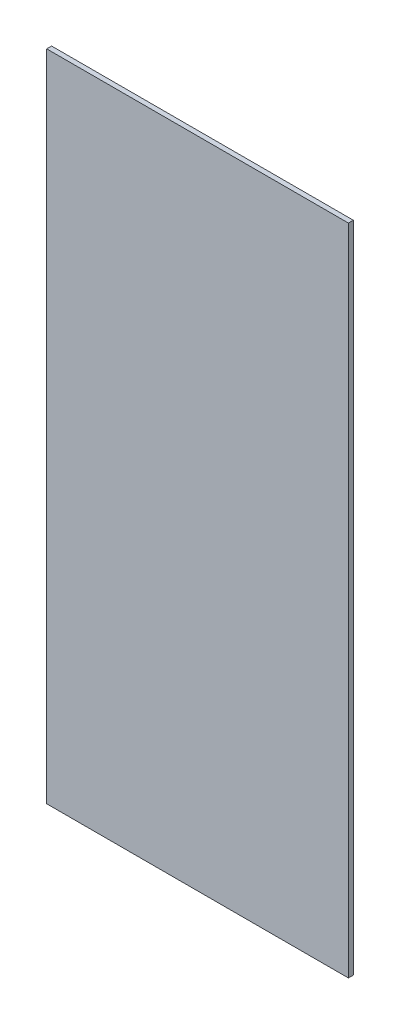
ISO-10303-21;
HEADER;
FILE_DESCRIPTION(('STEP AP214'),'2;1');
FILE_NAME('part.step','',(''),(''),'','','');
FILE_SCHEMA(('AUTOMOTIVE_DESIGN { 1 0 10303 214 1 1 1 1 }'));
ENDSEC;
DATA;
#1=APPLICATION_CONTEXT('core data for automotive mechanical design processes');
#2=APPLICATION_PROTOCOL_DEFINITION('international standard','automotive_design',2000,#1);
#3=PRODUCT_CONTEXT('',#1,'mechanical');
#4=PRODUCT('Part','Part','',(#3));
#5=PRODUCT_RELATED_PRODUCT_CATEGORY('part','',(#4));
#6=PRODUCT_DEFINITION_FORMATION('','',#4);
#7=PRODUCT_DEFINITION_CONTEXT('part definition',#1,'design');
#8=PRODUCT_DEFINITION('design','',#6,#7);
#9=PRODUCT_DEFINITION_SHAPE('','',#8);
#10=(LENGTH_UNIT() NAMED_UNIT(*) SI_UNIT(.MILLI.,.METRE.));
#11=(NAMED_UNIT(*) PLANE_ANGLE_UNIT() SI_UNIT($,.RADIAN.));
#12=(NAMED_UNIT(*) SI_UNIT($,.STERADIAN.) SOLID_ANGLE_UNIT());
#13=UNCERTAINTY_MEASURE_WITH_UNIT(LENGTH_MEASURE(1.E-05),#10,'distance_accuracy_value','');
#14=(GEOMETRIC_REPRESENTATION_CONTEXT(3) GLOBAL_UNCERTAINTY_ASSIGNED_CONTEXT((#13)) GLOBAL_UNIT_ASSIGNED_CONTEXT((#10,
#11,#12)) REPRESENTATION_CONTEXT('',''));
#15=CARTESIAN_POINT('',(0.,0.,0.));
#16=DIRECTION('',(0.,0.,1.));
#17=DIRECTION('',(1.,0.,0.));
#18=AXIS2_PLACEMENT_3D('',#15,#16,#17);
#19=CARTESIAN_POINT('',(0.,533.,0.));
#20=DIRECTION('',(1.,0.,0.));
#21=DIRECTION('',(0.,0.,-1.));
#22=AXIS2_PLACEMENT_3D('',#19,#20,#21);
#23=PLANE('',#22);
#24=DIRECTION('',(0.,0.,1.));
#25=VECTOR('',#24,1.);
#26=CARTESIAN_POINT('',(0.,0.,0.));
#27=LINE('',#26,#25);
#28=CARTESIAN_POINT('',(0.,0.,0.));
#29=VERTEX_POINT('',#28);
#30=CARTESIAN_POINT('',(0.,0.,4.));
#31=VERTEX_POINT('',#30);
#32=EDGE_CURVE('E96',#29,#31,#27,.T.);
#33=ORIENTED_EDGE('',*,*,#32,.T.);
#34=DIRECTION('',(0.,-1.,0.));
#35=VECTOR('',#34,1.);
#36=CARTESIAN_POINT('',(0.,533.,4.));
#37=LINE('',#36,#35);
#38=CARTESIAN_POINT('',(0.,533.,4.));
#39=VERTEX_POINT('',#38);
#40=EDGE_CURVE('E11',#39,#31,#37,.T.);
#41=ORIENTED_EDGE('',*,*,#40,.F.);
#42=DIRECTION('',(0.,0.,1.));
#43=VECTOR('',#42,1.);
#44=CARTESIAN_POINT('',(0.,533.,0.));
#45=LINE('',#44,#43);
#46=CARTESIAN_POINT('',(0.,533.,0.));
#47=VERTEX_POINT('',#46);
#48=EDGE_CURVE('E84',#47,#39,#45,.T.);
#49=ORIENTED_EDGE('',*,*,#48,.F.);
#50=DIRECTION('',(0.,-1.,0.));
#51=VECTOR('',#50,1.);
#52=CARTESIAN_POINT('',(0.,533.,0.));
#53=LINE('',#52,#51);
#54=EDGE_CURVE('E92',#47,#29,#53,.T.);
#55=ORIENTED_EDGE('',*,*,#54,.T.);
#56=EDGE_LOOP('',(#33,#41,#49,#55));
#57=FACE_BOUND('',#56,.T.);
#58=ADVANCED_FACE('F33',(#57),#23,.F.);
#59=CARTESIAN_POINT('',(0.,533.,4.));
#60=DIRECTION('',(0.,0.,-1.));
#61=DIRECTION('',(-1.,0.,0.));
#62=AXIS2_PLACEMENT_3D('',#59,#60,#61);
#63=PLANE('',#62);
#64=DIRECTION('',(1.,0.,0.));
#65=VECTOR('',#64,1.);
#66=CARTESIAN_POINT('',(0.,0.,4.));
#67=LINE('',#66,#65);
#68=CARTESIAN_POINT('',(245.985170549936,0.,4.));
#69=VERTEX_POINT('',#68);
#70=EDGE_CURVE('E88',#31,#69,#67,.T.);
#71=ORIENTED_EDGE('',*,*,#70,.T.);
#72=DIRECTION('',(0.,-1.,0.));
#73=VECTOR('',#72,1.);
#74=CARTESIAN_POINT('',(245.985170549936,533.,4.));
#75=LINE('',#74,#73);
#76=CARTESIAN_POINT('',(245.985170549936,533.,4.));
#77=VERTEX_POINT('',#76);
#78=EDGE_CURVE('E41',#77,#69,#75,.T.);
#79=ORIENTED_EDGE('',*,*,#78,.F.);
#80=DIRECTION('',(1.,0.,0.));
#81=VECTOR('',#80,1.);
#82=CARTESIAN_POINT('',(0.,533.,4.));
#83=LINE('',#82,#81);
#84=EDGE_CURVE('E79',#39,#77,#83,.T.);
#85=ORIENTED_EDGE('',*,*,#84,.F.);
#86=ORIENTED_EDGE('',*,*,#40,.T.);
#87=EDGE_LOOP('',(#71,#79,#85,#86));
#88=FACE_BOUND('',#87,.T.);
#89=ADVANCED_FACE('F87',(#88),#63,.F.);
#90=CARTESIAN_POINT('',(245.985170549936,533.,0.));
#91=DIRECTION('',(-1.,0.,0.));
#92=DIRECTION('',(0.,0.,1.));
#93=AXIS2_PLACEMENT_3D('',#90,#91,#92);
#94=PLANE('',#93);
#95=DIRECTION('',(0.,0.,-1.));
#96=VECTOR('',#95,1.);
#97=CARTESIAN_POINT('',(245.985170549936,0.,0.));
#98=LINE('',#97,#96);
#99=CARTESIAN_POINT('',(245.985170549936,0.,0.));
#100=VERTEX_POINT('',#99);
#101=EDGE_CURVE('E66',#69,#100,#98,.T.);
#102=ORIENTED_EDGE('',*,*,#101,.T.);
#103=DIRECTION('',(0.,-1.,0.));
#104=VECTOR('',#103,1.);
#105=CARTESIAN_POINT('',(245.985170549936,533.,0.));
#106=LINE('',#105,#104);
#107=CARTESIAN_POINT('',(245.985170549936,533.,0.));
#108=VERTEX_POINT('',#107);
#109=EDGE_CURVE('E89',#108,#100,#106,.T.);
#110=ORIENTED_EDGE('',*,*,#109,.F.);
#111=DIRECTION('',(0.,0.,-1.));
#112=VECTOR('',#111,1.);
#113=CARTESIAN_POINT('',(245.985170549936,533.,0.));
#114=LINE('',#113,#112);
#115=EDGE_CURVE('E82',#77,#108,#114,.T.);
#116=ORIENTED_EDGE('',*,*,#115,.F.);
#117=ORIENTED_EDGE('',*,*,#78,.T.);
#118=EDGE_LOOP('',(#102,#110,#116,#117));
#119=FACE_BOUND('',#118,.T.);
#120=ADVANCED_FACE('F90',(#119),#94,.F.);
#121=CARTESIAN_POINT('',(0.,533.,0.));
#122=DIRECTION('',(0.,0.,1.));
#123=DIRECTION('',(1.,0.,0.));
#124=AXIS2_PLACEMENT_3D('',#121,#122,#123);
#125=PLANE('',#124);
#126=DIRECTION('',(-1.,0.,0.));
#127=VECTOR('',#126,1.);
#128=CARTESIAN_POINT('',(0.,0.,0.));
#129=LINE('',#128,#127);
#130=EDGE_CURVE('E72',#100,#29,#129,.T.);
#131=ORIENTED_EDGE('',*,*,#130,.T.);
#132=ORIENTED_EDGE('',*,*,#54,.F.);
#133=DIRECTION('',(-1.,0.,0.));
#134=VECTOR('',#133,1.);
#135=CARTESIAN_POINT('',(0.,533.,0.));
#136=LINE('',#135,#134);
#137=EDGE_CURVE('E49',#108,#47,#136,.T.);
#138=ORIENTED_EDGE('',*,*,#137,.F.);
#139=ORIENTED_EDGE('',*,*,#109,.T.);
#140=EDGE_LOOP('',(#131,#132,#138,#139));
#141=FACE_BOUND('',#140,.T.);
#142=ADVANCED_FACE('F103',(#141),#125,.F.);
#143=CARTESIAN_POINT('',(0.,533.,4.));
#144=DIRECTION('',(0.,1.,0.));
#145=DIRECTION('',(0.,0.,1.));
#146=AXIS2_PLACEMENT_3D('',#143,#144,#145);
#147=PLANE('',#146);
#148=ORIENTED_EDGE('',*,*,#48,.T.);
#149=ORIENTED_EDGE('',*,*,#84,.T.);
#150=ORIENTED_EDGE('',*,*,#115,.T.);
#151=ORIENTED_EDGE('',*,*,#137,.T.);
#152=EDGE_LOOP('',(#148,#149,#150,#151));
#153=FACE_BOUND('',#152,.T.);
#154=ADVANCED_FACE('F80',(#153),#147,.T.);
#155=CARTESIAN_POINT('',(0.,0.,4.));
#156=DIRECTION('',(0.,1.,0.));
#157=DIRECTION('',(0.,0.,1.));
#158=AXIS2_PLACEMENT_3D('',#155,#156,#157);
#159=PLANE('',#158);
#160=ORIENTED_EDGE('',*,*,#32,.F.);
#161=ORIENTED_EDGE('',*,*,#130,.F.);
#162=ORIENTED_EDGE('',*,*,#101,.F.);
#163=ORIENTED_EDGE('',*,*,#70,.F.);
#164=EDGE_LOOP('',(#160,#161,#162,#163));
#165=FACE_BOUND('',#164,.T.);
#166=ADVANCED_FACE('F106',(#165),#159,.F.);
#167=CLOSED_SHELL('',(#58,#89,#120,#142,#154,#166));
#168=MANIFOLD_SOLID_BREP('B2',#167);
#169=ADVANCED_BREP_SHAPE_REPRESENTATION('',(#18,#168),#14);
#170=SHAPE_DEFINITION_REPRESENTATION(#9,#169);
ENDSEC;
END-ISO-10303-21;
